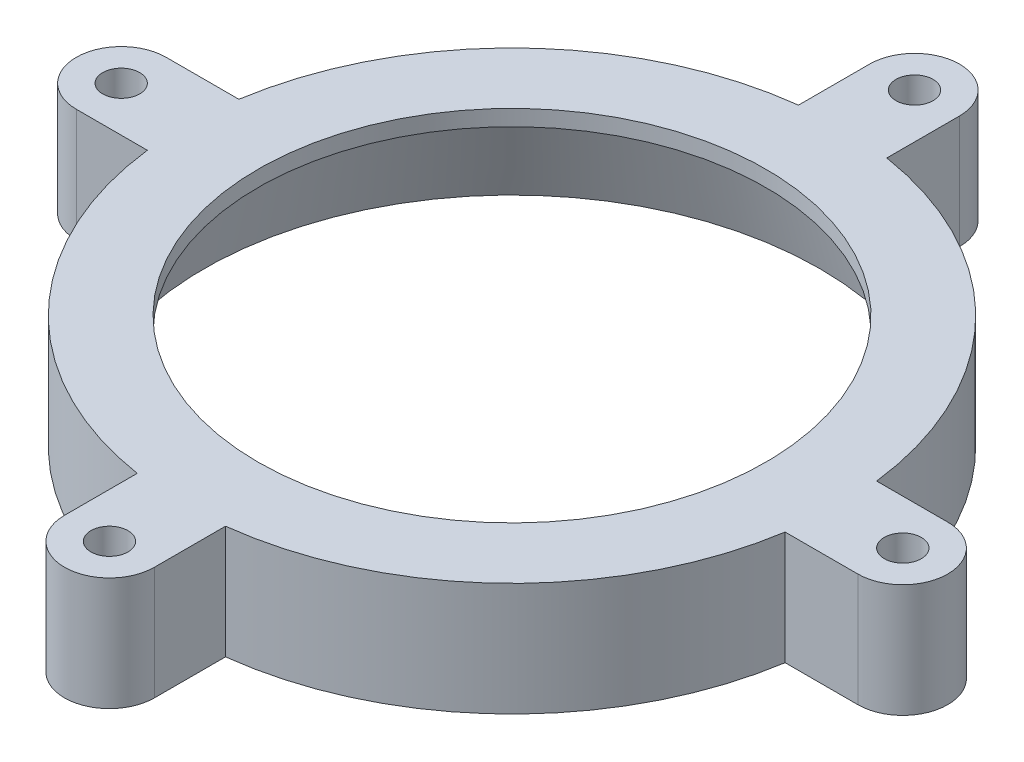
ISO-10303-21;
HEADER;
FILE_DESCRIPTION(('STEP AP214'),'2;1');
FILE_NAME('part.step','',(''),(''),'','','');
FILE_SCHEMA(('AUTOMOTIVE_DESIGN { 1 0 10303 214 1 1 1 1 }'));
ENDSEC;
DATA;
#1=APPLICATION_CONTEXT('core data for automotive mechanical design processes');
#2=APPLICATION_PROTOCOL_DEFINITION('international standard','automotive_design',2000,#1);
#3=PRODUCT_CONTEXT('',#1,'mechanical');
#4=PRODUCT('Part','Part','',(#3));
#5=PRODUCT_RELATED_PRODUCT_CATEGORY('part','',(#4));
#6=PRODUCT_DEFINITION_FORMATION('','',#4);
#7=PRODUCT_DEFINITION_CONTEXT('part definition',#1,'design');
#8=PRODUCT_DEFINITION('design','',#6,#7);
#9=PRODUCT_DEFINITION_SHAPE('','',#8);
#10=(LENGTH_UNIT() NAMED_UNIT(*) SI_UNIT(.MILLI.,.METRE.));
#11=(NAMED_UNIT(*) PLANE_ANGLE_UNIT() SI_UNIT($,.RADIAN.));
#12=(NAMED_UNIT(*) SI_UNIT($,.STERADIAN.) SOLID_ANGLE_UNIT());
#13=UNCERTAINTY_MEASURE_WITH_UNIT(LENGTH_MEASURE(1.E-05),#10,'distance_accuracy_value','');
#14=(GEOMETRIC_REPRESENTATION_CONTEXT(3) GLOBAL_UNCERTAINTY_ASSIGNED_CONTEXT((#13)) GLOBAL_UNIT_ASSIGNED_CONTEXT((#10,
#11,#12)) REPRESENTATION_CONTEXT('',''));
#15=CARTESIAN_POINT('',(0.,0.,0.));
#16=DIRECTION('',(0.,0.,1.));
#17=DIRECTION('',(1.,0.,0.));
#18=AXIS2_PLACEMENT_3D('',#15,#16,#17);
#19=CARTESIAN_POINT('',(-75.,-30.2482160476003,-1.11033693465306));
#20=DIRECTION('',(0.,1.,0.));
#21=DIRECTION('',(0.,0.,1.));
#22=AXIS2_PLACEMENT_3D('',#19,#20,#21);
#23=CYLINDRICAL_SURFACE('',#22,2.125);
#24=CARTESIAN_POINT('',(-75.,0.,-1.11033693465306));
#25=DIRECTION('',(0.,1.,0.));
#26=DIRECTION('',(0.,0.,1.));
#27=AXIS2_PLACEMENT_3D('',#24,#25,#26);
#28=CIRCLE('',#27,2.125);
#29=CARTESIAN_POINT('',(-75.,0.,1.01466306534694));
#30=VERTEX_POINT('',#29);
#31=EDGE_CURVE('E247',#30,#30,#28,.F.);
#32=ORIENTED_EDGE('',*,*,#31,.T.);
#33=EDGE_LOOP('',(#32));
#34=FACE_BOUND('',#33,.T.);
#35=CARTESIAN_POINT('',(-75.,12.,-1.11033693465306));
#36=DIRECTION('',(0.,1.,0.));
#37=DIRECTION('',(0.,0.,1.));
#38=AXIS2_PLACEMENT_3D('',#35,#36,#37);
#39=CIRCLE('',#38,2.125);
#40=CARTESIAN_POINT('',(-75.,12.,1.01466306534694));
#41=VERTEX_POINT('',#40);
#42=EDGE_CURVE('E43',#41,#41,#39,.F.);
#43=ORIENTED_EDGE('',*,*,#42,.F.);
#44=EDGE_LOOP('',(#43));
#45=FACE_BOUND('',#44,.T.);
#46=ADVANCED_FACE('F39',(#34,#45),#23,.F.);
#47=CARTESIAN_POINT('',(1.11033693465227,-30.2482160476005,-75.));
#48=DIRECTION('',(0.,1.,0.));
#49=DIRECTION('',(0.,0.,1.));
#50=AXIS2_PLACEMENT_3D('',#47,#48,#49);
#51=CYLINDRICAL_SURFACE('',#50,2.125);
#52=CARTESIAN_POINT('',(1.11033693465227,0.,-75.));
#53=DIRECTION('',(0.,1.,0.));
#54=DIRECTION('',(0.,0.,1.));
#55=AXIS2_PLACEMENT_3D('',#52,#53,#54);
#56=CIRCLE('',#55,2.125);
#57=CARTESIAN_POINT('',(1.11033693465227,0.,-72.875));
#58=VERTEX_POINT('',#57);
#59=EDGE_CURVE('E203',#58,#58,#56,.F.);
#60=ORIENTED_EDGE('',*,*,#59,.T.);
#61=EDGE_LOOP('',(#60));
#62=FACE_BOUND('',#61,.T.);
#63=CARTESIAN_POINT('',(1.11033693465227,12.,-75.));
#64=DIRECTION('',(0.,1.,0.));
#65=DIRECTION('',(0.,0.,1.));
#66=AXIS2_PLACEMENT_3D('',#63,#64,#65);
#67=CIRCLE('',#66,2.125);
#68=CARTESIAN_POINT('',(1.11033693465227,12.,-72.875));
#69=VERTEX_POINT('',#68);
#70=EDGE_CURVE('E294',#69,#69,#67,.F.);
#71=ORIENTED_EDGE('',*,*,#70,.F.);
#72=EDGE_LOOP('',(#71));
#73=FACE_BOUND('',#72,.T.);
#74=ADVANCED_FACE('F304',(#62,#73),#51,.F.);
#75=CARTESIAN_POINT('',(75.,-30.2482160476003,1.11033693465306));
#76=DIRECTION('',(0.,1.,0.));
#77=DIRECTION('',(0.,0.,1.));
#78=AXIS2_PLACEMENT_3D('',#75,#76,#77);
#79=CYLINDRICAL_SURFACE('',#78,2.125);
#80=CARTESIAN_POINT('',(75.,0.,1.11033693465306));
#81=DIRECTION('',(0.,1.,0.));
#82=DIRECTION('',(0.,0.,1.));
#83=AXIS2_PLACEMENT_3D('',#80,#81,#82);
#84=CIRCLE('',#83,2.125);
#85=CARTESIAN_POINT('',(75.,0.,3.23533693465306));
#86=VERTEX_POINT('',#85);
#87=EDGE_CURVE('E179',#86,#86,#84,.F.);
#88=ORIENTED_EDGE('',*,*,#87,.T.);
#89=EDGE_LOOP('',(#88));
#90=FACE_BOUND('',#89,.T.);
#91=CARTESIAN_POINT('',(75.,12.,1.11033693465306));
#92=DIRECTION('',(0.,1.,0.));
#93=DIRECTION('',(0.,0.,1.));
#94=AXIS2_PLACEMENT_3D('',#91,#92,#93);
#95=CIRCLE('',#94,2.125);
#96=CARTESIAN_POINT('',(75.,12.,3.23533693465306));
#97=VERTEX_POINT('',#96);
#98=EDGE_CURVE('E291',#97,#97,#95,.F.);
#99=ORIENTED_EDGE('',*,*,#98,.F.);
#100=EDGE_LOOP('',(#99));
#101=FACE_BOUND('',#100,.T.);
#102=ADVANCED_FACE('F311',(#90,#101),#79,.F.);
#103=CARTESIAN_POINT('',(-1.1103369346528,-30.2482160476003,75.));
#104=DIRECTION('',(0.,1.,0.));
#105=DIRECTION('',(0.,0.,1.));
#106=AXIS2_PLACEMENT_3D('',#103,#104,#105);
#107=CYLINDRICAL_SURFACE('',#106,2.125);
#108=CARTESIAN_POINT('',(-1.1103369346528,0.,75.));
#109=DIRECTION('',(0.,1.,0.));
#110=DIRECTION('',(0.,0.,1.));
#111=AXIS2_PLACEMENT_3D('',#108,#109,#110);
#112=CIRCLE('',#111,2.125);
#113=CARTESIAN_POINT('',(-1.1103369346528,0.,77.125));
#114=VERTEX_POINT('',#113);
#115=EDGE_CURVE('E189',#114,#114,#112,.F.);
#116=ORIENTED_EDGE('',*,*,#115,.T.);
#117=EDGE_LOOP('',(#116));
#118=FACE_BOUND('',#117,.T.);
#119=CARTESIAN_POINT('',(-1.1103369346528,12.,75.));
#120=DIRECTION('',(0.,1.,0.));
#121=DIRECTION('',(0.,0.,1.));
#122=AXIS2_PLACEMENT_3D('',#119,#120,#121);
#123=CIRCLE('',#122,2.125);
#124=CARTESIAN_POINT('',(-1.1103369346528,12.,77.125));
#125=VERTEX_POINT('',#124);
#126=EDGE_CURVE('E288',#125,#125,#123,.F.);
#127=ORIENTED_EDGE('',*,*,#126,.F.);
#128=EDGE_LOOP('',(#127));
#129=FACE_BOUND('',#128,.T.);
#130=ADVANCED_FACE('F369',(#118,#129),#107,.F.);
#131=CARTESIAN_POINT('',(0.,18.4,0.));
#132=DIRECTION('',(0.,-1.,0.));
#133=DIRECTION('',(0.,0.,-1.));
#134=AXIS2_PLACEMENT_3D('',#131,#132,#133);
#135=CYLINDRICAL_SURFACE('',#134,62.);
#136=DIRECTION('',(0.,-1.,0.));
#137=VECTOR('',#136,1.);
#138=CARTESIAN_POINT('',(7.38966306534715,18.4,61.558044801477));
#139=LINE('',#138,#137);
#140=CARTESIAN_POINT('',(7.38966306534715,0.,61.558044801477));
#141=VERTEX_POINT('',#140);
#142=CARTESIAN_POINT('',(7.38966306534715,21.4,61.558044801477));
#143=VERTEX_POINT('',#142);
#144=EDGE_CURVE('E170',#141,#143,#139,.F.);
#145=ORIENTED_EDGE('',*,*,#144,.F.);
#146=CARTESIAN_POINT('',(0.,0.,0.));
#147=DIRECTION('',(0.,-1.,0.));
#148=DIRECTION('',(0.,0.,-1.));
#149=AXIS2_PLACEMENT_3D('',#146,#147,#148);
#150=CIRCLE('',#149,62.);
#151=CARTESIAN_POINT('',(61.2506442741825,0.,9.61033693465306));
#152=VERTEX_POINT('',#151);
#153=EDGE_CURVE('E358',#152,#141,#150,.T.);
#154=ORIENTED_EDGE('',*,*,#153,.F.);
#155=DIRECTION('',(0.,-1.,0.));
#156=VECTOR('',#155,1.);
#157=CARTESIAN_POINT('',(61.2506442741825,18.4,9.61033693465306));
#158=LINE('',#157,#156);
#159=CARTESIAN_POINT('',(61.2506442741825,21.4,9.61033693465306));
#160=VERTEX_POINT('',#159);
#161=EDGE_CURVE('E237',#160,#152,#158,.T.);
#162=ORIENTED_EDGE('',*,*,#161,.F.);
#163=CARTESIAN_POINT('',(0.,21.4,0.));
#164=DIRECTION('',(0.,1.,0.));
#165=DIRECTION('',(0.,0.,1.));
#166=AXIS2_PLACEMENT_3D('',#163,#164,#165);
#167=CIRCLE('',#166,62.);
#168=EDGE_CURVE('E281',#143,#160,#167,.T.);
#169=ORIENTED_EDGE('',*,*,#168,.F.);
#170=EDGE_LOOP('',(#145,#154,#162,#169));
#171=FACE_BOUND('',#170,.T.);
#172=ADVANCED_FACE('F345',(#171),#135,.T.);
#173=DIRECTION('',(0.,-1.,0.));
#174=VECTOR('',#173,1.);
#175=CARTESIAN_POINT('',(61.558044801477,18.4,-7.38966306534694));
#176=LINE('',#175,#174);
#177=CARTESIAN_POINT('',(61.558044801477,0.,-7.38966306534694));
#178=VERTEX_POINT('',#177);
#179=CARTESIAN_POINT('',(61.558044801477,21.4,-7.38966306534694));
#180=VERTEX_POINT('',#179);
#181=EDGE_CURVE('E239',#178,#180,#176,.F.);
#182=ORIENTED_EDGE('',*,*,#181,.F.);
#183=CARTESIAN_POINT('',(9.61033693465242,0.,-61.2506442741826));
#184=VERTEX_POINT('',#183);
#185=EDGE_CURVE('E283',#184,#178,#150,.T.);
#186=ORIENTED_EDGE('',*,*,#185,.F.);
#187=DIRECTION('',(0.,-1.,0.));
#188=VECTOR('',#187,1.);
#189=CARTESIAN_POINT('',(9.61033693465242,18.4,-61.2506442741826));
#190=LINE('',#189,#188);
#191=CARTESIAN_POINT('',(9.61033693465242,21.4,-61.2506442741826));
#192=VERTEX_POINT('',#191);
#193=EDGE_CURVE('E192',#192,#184,#190,.T.);
#194=ORIENTED_EDGE('',*,*,#193,.F.);
#195=EDGE_CURVE('E430',#180,#192,#167,.T.);
#196=ORIENTED_EDGE('',*,*,#195,.F.);
#197=EDGE_LOOP('',(#182,#186,#194,#196));
#198=FACE_BOUND('',#197,.T.);
#199=ADVANCED_FACE('F354',(#198),#135,.T.);
#200=DIRECTION('',(0.,-1.,0.));
#201=VECTOR('',#200,1.);
#202=CARTESIAN_POINT('',(-7.38966306534758,18.4,-61.5580448014769));
#203=LINE('',#202,#201);
#204=CARTESIAN_POINT('',(-7.38966306534758,0.,-61.5580448014769));
#205=VERTEX_POINT('',#204);
#206=CARTESIAN_POINT('',(-7.38966306534758,21.4,-61.5580448014769));
#207=VERTEX_POINT('',#206);
#208=EDGE_CURVE('E235',#205,#207,#203,.F.);
#209=ORIENTED_EDGE('',*,*,#208,.F.);
#210=CARTESIAN_POINT('',(-61.2506442741825,0.,-9.61033693465306));
#211=VERTEX_POINT('',#210);
#212=EDGE_CURVE('E48',#211,#205,#150,.T.);
#213=ORIENTED_EDGE('',*,*,#212,.F.);
#214=DIRECTION('',(0.,-1.,0.));
#215=VECTOR('',#214,1.);
#216=CARTESIAN_POINT('',(-61.2506442741825,18.4,-9.61033693465306));
#217=LINE('',#216,#215);
#218=CARTESIAN_POINT('',(-61.2506442741825,21.4,-9.61033693465306));
#219=VERTEX_POINT('',#218);
#220=EDGE_CURVE('E266',#219,#211,#217,.T.);
#221=ORIENTED_EDGE('',*,*,#220,.F.);
#222=EDGE_CURVE('E275',#207,#219,#167,.T.);
#223=ORIENTED_EDGE('',*,*,#222,.F.);
#224=EDGE_LOOP('',(#209,#213,#221,#223));
#225=FACE_BOUND('',#224,.T.);
#226=ADVANCED_FACE('F346',(#225),#135,.T.);
#227=CARTESIAN_POINT('',(0.,0.,0.));
#228=DIRECTION('',(0.,1.,0.));
#229=DIRECTION('',(0.,0.,1.));
#230=AXIS2_PLACEMENT_3D('',#227,#228,#229);
#231=PLANE('',#230);
#232=ORIENTED_EDGE('',*,*,#153,.T.);
#233=DIRECTION('',(0.,0.,1.));
#234=VECTOR('',#233,1.);
#235=CARTESIAN_POINT('',(7.38966306534714,0.,58.4809158028855));
#236=LINE('',#235,#234);
#237=CARTESIAN_POINT('',(7.3896630653472,0.,75.));
#238=VERTEX_POINT('',#237);
#239=EDGE_CURVE('E193',#141,#238,#236,.T.);
#240=ORIENTED_EDGE('',*,*,#239,.T.);
#241=CARTESIAN_POINT('',(-1.1103369346528,0.,75.));
#242=DIRECTION('',(0.,1.,0.));
#243=DIRECTION('',(0.,0.,1.));
#244=AXIS2_PLACEMENT_3D('',#241,#242,#243);
#245=CIRCLE('',#244,8.5);
#246=CARTESIAN_POINT('',(-9.6103369346528,0.,75.));
#247=VERTEX_POINT('',#246);
#248=EDGE_CURVE('E161',#238,#247,#245,.F.);
#249=ORIENTED_EDGE('',*,*,#248,.T.);
#250=DIRECTION('',(0.,0.,-1.));
#251=VECTOR('',#250,1.);
#252=CARTESIAN_POINT('',(-9.6103369346528,0.,75.));
#253=LINE('',#252,#251);
#254=CARTESIAN_POINT('',(-9.61033693465285,0.,61.2506442741825));
#255=VERTEX_POINT('',#254);
#256=EDGE_CURVE('E56',#247,#255,#253,.T.);
#257=ORIENTED_EDGE('',*,*,#256,.T.);
#258=CARTESIAN_POINT('',(-61.558044801477,0.,7.38966306534694));
#259=VERTEX_POINT('',#258);
#260=EDGE_CURVE('E284',#255,#259,#150,.T.);
#261=ORIENTED_EDGE('',*,*,#260,.T.);
#262=DIRECTION('',(-1.,0.,0.));
#263=VECTOR('',#262,1.);
#264=CARTESIAN_POINT('',(-58.4809158028855,0.,7.38966306534694));
#265=LINE('',#264,#263);
#266=CARTESIAN_POINT('',(-75.,0.,7.38966306534694));
#267=VERTEX_POINT('',#266);
#268=EDGE_CURVE('E245',#259,#267,#265,.T.);
#269=ORIENTED_EDGE('',*,*,#268,.T.);
#270=CARTESIAN_POINT('',(-75.,0.,-1.11033693465306));
#271=DIRECTION('',(0.,1.,0.));
#272=DIRECTION('',(0.,0.,1.));
#273=AXIS2_PLACEMENT_3D('',#270,#271,#272);
#274=CIRCLE('',#273,8.5);
#275=CARTESIAN_POINT('',(-75.,0.,-9.61033693465306));
#276=VERTEX_POINT('',#275);
#277=EDGE_CURVE('E248',#267,#276,#274,.F.);
#278=ORIENTED_EDGE('',*,*,#277,.T.);
#279=DIRECTION('',(1.,0.,0.));
#280=VECTOR('',#279,1.);
#281=CARTESIAN_POINT('',(-75.,0.,-9.61033693465306));
#282=LINE('',#281,#280);
#283=EDGE_CURVE('E249',#276,#211,#282,.T.);
#284=ORIENTED_EDGE('',*,*,#283,.T.);
#285=ORIENTED_EDGE('',*,*,#212,.T.);
#286=DIRECTION('',(0.,0.,-1.));
#287=VECTOR('',#286,1.);
#288=CARTESIAN_POINT('',(-7.38966306534755,0.,-58.4809158028855));
#289=LINE('',#288,#287);
#290=CARTESIAN_POINT('',(-7.38966306534773,0.,-74.9999999999999));
#291=VERTEX_POINT('',#290);
#292=EDGE_CURVE('E212',#205,#291,#289,.T.);
#293=ORIENTED_EDGE('',*,*,#292,.T.);
#294=CARTESIAN_POINT('',(1.11033693465227,0.,-75.));
#295=DIRECTION('',(0.,1.,0.));
#296=DIRECTION('',(0.,0.,1.));
#297=AXIS2_PLACEMENT_3D('',#294,#295,#296);
#298=CIRCLE('',#297,8.5);
#299=CARTESIAN_POINT('',(9.61033693465227,0.,-75.0000000000001));
#300=VERTEX_POINT('',#299);
#301=EDGE_CURVE('E214',#291,#300,#298,.F.);
#302=ORIENTED_EDGE('',*,*,#301,.T.);
#303=DIRECTION('',(0.,0.,1.));
#304=VECTOR('',#303,1.);
#305=CARTESIAN_POINT('',(9.61033693465227,0.,-75.0000000000001));
#306=LINE('',#305,#304);
#307=EDGE_CURVE('E215',#300,#184,#306,.T.);
#308=ORIENTED_EDGE('',*,*,#307,.T.);
#309=ORIENTED_EDGE('',*,*,#185,.T.);
#310=DIRECTION('',(1.,0.,0.));
#311=VECTOR('',#310,1.);
#312=CARTESIAN_POINT('',(58.4809158028855,0.,-7.38966306534694));
#313=LINE('',#312,#311);
#314=CARTESIAN_POINT('',(75.,0.,-7.38966306534694));
#315=VERTEX_POINT('',#314);
#316=EDGE_CURVE('E182',#178,#315,#313,.T.);
#317=ORIENTED_EDGE('',*,*,#316,.T.);
#318=CARTESIAN_POINT('',(75.,0.,1.11033693465306));
#319=DIRECTION('',(0.,1.,0.));
#320=DIRECTION('',(0.,0.,1.));
#321=AXIS2_PLACEMENT_3D('',#318,#319,#320);
#322=CIRCLE('',#321,8.5);
#323=CARTESIAN_POINT('',(75.,0.,9.61033693465306));
#324=VERTEX_POINT('',#323);
#325=EDGE_CURVE('E195',#315,#324,#322,.F.);
#326=ORIENTED_EDGE('',*,*,#325,.T.);
#327=DIRECTION('',(-1.,0.,0.));
#328=VECTOR('',#327,1.);
#329=CARTESIAN_POINT('',(75.,0.,9.61033693465306));
#330=LINE('',#329,#328);
#331=EDGE_CURVE('E63',#324,#152,#330,.T.);
#332=ORIENTED_EDGE('',*,*,#331,.T.);
#333=EDGE_LOOP('',(#232,#240,#249,#257,#261,#269,#278,#284,#285,#293,#302,#308,#309,#317,#326,#332));
#334=FACE_BOUND('',#333,.T.);
#335=CARTESIAN_POINT('',(0.,0.,0.));
#336=DIRECTION('',(0.,1.,0.));
#337=DIRECTION('',(0.,0.,1.));
#338=AXIS2_PLACEMENT_3D('',#335,#336,#337);
#339=CIRCLE('',#338,58.2);
#340=CARTESIAN_POINT('',(0.,0.,58.2));
#341=VERTEX_POINT('',#340);
#342=EDGE_CURVE('E11',#341,#341,#339,.T.);
#343=ORIENTED_EDGE('',*,*,#342,.T.);
#344=EDGE_LOOP('',(#343));
#345=FACE_BOUND('',#344,.T.);
#346=ORIENTED_EDGE('',*,*,#31,.F.);
#347=EDGE_LOOP('',(#346));
#348=FACE_BOUND('',#347,.T.);
#349=ORIENTED_EDGE('',*,*,#59,.F.);
#350=EDGE_LOOP('',(#349));
#351=FACE_BOUND('',#350,.T.);
#352=ORIENTED_EDGE('',*,*,#87,.F.);
#353=EDGE_LOOP('',(#352));
#354=FACE_BOUND('',#353,.T.);
#355=ORIENTED_EDGE('',*,*,#115,.F.);
#356=EDGE_LOOP('',(#355));
#357=FACE_BOUND('',#356,.T.);
#358=ADVANCED_FACE('F347',(#334,#345,#348,#351,#354,#357),#231,.F.);
#359=CARTESIAN_POINT('',(0.,0.,0.));
#360=DIRECTION('',(0.,-1.,0.));
#361=DIRECTION('',(0.,0.,1.));
#362=AXIS2_PLACEMENT_3D('',#359,#360,#361);
#363=CONICAL_SURFACE('',#362,58.2,0.26179938779915);
#364=CARTESIAN_POINT('',(0.,18.4,0.));
#365=DIRECTION('',(0.,1.,0.));
#366=DIRECTION('',(0.,0.,1.));
#367=AXIS2_PLACEMENT_3D('',#364,#365,#366);
#368=CIRCLE('',#367,53.2697348592673);
#369=CARTESIAN_POINT('',(0.,18.4,53.2697348592673));
#370=VERTEX_POINT('',#369);
#371=EDGE_CURVE('E280',#370,#370,#368,.T.);
#372=ORIENTED_EDGE('',*,*,#371,.T.);
#373=EDGE_LOOP('',(#372));
#374=FACE_BOUND('',#373,.T.);
#375=ORIENTED_EDGE('',*,*,#342,.F.);
#376=EDGE_LOOP('',(#375));
#377=FACE_BOUND('',#376,.T.);
#378=ADVANCED_FACE('F41',(#374,#377),#363,.F.);
#379=DIRECTION('',(0.,-1.,0.));
#380=VECTOR('',#379,1.);
#381=CARTESIAN_POINT('',(-9.61033693465285,18.4,61.2506442741825));
#382=LINE('',#381,#380);
#383=CARTESIAN_POINT('',(-9.61033693465285,21.4,61.2506442741825));
#384=VERTEX_POINT('',#383);
#385=EDGE_CURVE('E241',#384,#255,#382,.T.);
#386=ORIENTED_EDGE('',*,*,#385,.F.);
#387=CARTESIAN_POINT('',(-61.558044801477,21.4,7.38966306534694));
#388=VERTEX_POINT('',#387);
#389=EDGE_CURVE('E278',#388,#384,#167,.T.);
#390=ORIENTED_EDGE('',*,*,#389,.F.);
#391=DIRECTION('',(0.,-1.,0.));
#392=VECTOR('',#391,1.);
#393=CARTESIAN_POINT('',(-61.558044801477,18.4,7.38966306534694));
#394=LINE('',#393,#392);
#395=EDGE_CURVE('E269',#259,#388,#394,.F.);
#396=ORIENTED_EDGE('',*,*,#395,.F.);
#397=ORIENTED_EDGE('',*,*,#260,.F.);
#398=EDGE_LOOP('',(#386,#390,#396,#397));
#399=FACE_BOUND('',#398,.T.);
#400=ADVANCED_FACE('F341',(#399),#135,.T.);
#401=CARTESIAN_POINT('',(0.,18.4,0.));
#402=DIRECTION('',(0.,1.,0.));
#403=DIRECTION('',(0.,0.,1.));
#404=AXIS2_PLACEMENT_3D('',#401,#402,#403);
#405=PLANE('',#404);
#406=CARTESIAN_POINT('',(0.,18.4,0.));
#407=DIRECTION('',(0.,1.,0.));
#408=DIRECTION('',(0.,0.,1.));
#409=AXIS2_PLACEMENT_3D('',#406,#407,#408);
#410=CIRCLE('',#409,48.);
#411=CARTESIAN_POINT('',(0.,18.4,48.));
#412=VERTEX_POINT('',#411);
#413=EDGE_CURVE('E271',#412,#412,#410,.T.);
#414=ORIENTED_EDGE('',*,*,#413,.T.);
#415=EDGE_LOOP('',(#414));
#416=FACE_BOUND('',#415,.T.);
#417=ORIENTED_EDGE('',*,*,#371,.F.);
#418=EDGE_LOOP('',(#417));
#419=FACE_BOUND('',#418,.T.);
#420=ADVANCED_FACE('F337',(#416,#419),#405,.F.);
#421=CARTESIAN_POINT('',(0.,21.4,0.));
#422=DIRECTION('',(0.,1.,0.));
#423=DIRECTION('',(0.,0.,1.));
#424=AXIS2_PLACEMENT_3D('',#421,#422,#423);
#425=PLANE('',#424);
#426=CARTESIAN_POINT('',(-75.,21.4,-1.11033693465306));
#427=DIRECTION('',(0.,1.,0.));
#428=DIRECTION('',(0.,0.,1.));
#429=AXIS2_PLACEMENT_3D('',#426,#427,#428);
#430=CIRCLE('',#429,3.50000000000001);
#431=CARTESIAN_POINT('',(-75.,21.4,2.38966306534695));
#432=VERTEX_POINT('',#431);
#433=EDGE_CURVE('E475',#432,#432,#430,.T.);
#434=ORIENTED_EDGE('',*,*,#433,.F.);
#435=EDGE_LOOP('',(#434));
#436=FACE_BOUND('',#435,.T.);
#437=CARTESIAN_POINT('',(1.11033693465332,21.4,-75.));
#438=DIRECTION('',(0.,1.,0.));
#439=DIRECTION('',(0.,0.,1.));
#440=AXIS2_PLACEMENT_3D('',#437,#438,#439);
#441=CIRCLE('',#440,3.50000000000002);
#442=CARTESIAN_POINT('',(1.11033693465332,21.4,-71.5));
#443=VERTEX_POINT('',#442);
#444=EDGE_CURVE('E472',#443,#443,#441,.T.);
#445=ORIENTED_EDGE('',*,*,#444,.F.);
#446=EDGE_LOOP('',(#445));
#447=FACE_BOUND('',#446,.T.);
#448=CARTESIAN_POINT('',(75.,21.4,1.11033693465358));
#449=DIRECTION('',(0.,1.,0.));
#450=DIRECTION('',(0.,0.,1.));
#451=AXIS2_PLACEMENT_3D('',#448,#449,#450);
#452=CIRCLE('',#451,3.5);
#453=CARTESIAN_POINT('',(75.,21.4,4.61033693465358));
#454=VERTEX_POINT('',#453);
#455=EDGE_CURVE('E466',#454,#454,#452,.T.);
#456=ORIENTED_EDGE('',*,*,#455,.F.);
#457=EDGE_LOOP('',(#456));
#458=FACE_BOUND('',#457,.T.);
#459=CARTESIAN_POINT('',(-1.11033693465384,21.4,75.));
#460=DIRECTION('',(0.,1.,0.));
#461=DIRECTION('',(0.,0.,1.));
#462=AXIS2_PLACEMENT_3D('',#459,#460,#461);
#463=CIRCLE('',#462,3.50000000000001);
#464=CARTESIAN_POINT('',(-1.11033693465384,21.4,78.5));
#465=VERTEX_POINT('',#464);
#466=EDGE_CURVE('E460',#465,#465,#463,.T.);
#467=ORIENTED_EDGE('',*,*,#466,.F.);
#468=EDGE_LOOP('',(#467));
#469=FACE_BOUND('',#468,.T.);
#470=ORIENTED_EDGE('',*,*,#389,.T.);
#471=DIRECTION('',(0.,0.,1.));
#472=VECTOR('',#471,1.);
#473=CARTESIAN_POINT('',(-9.6103369346528,21.4,75.));
#474=LINE('',#473,#472);
#475=CARTESIAN_POINT('',(-9.6103369346528,21.4,75.));
#476=VERTEX_POINT('',#475);
#477=EDGE_CURVE('E164',#384,#476,#474,.T.);
#478=ORIENTED_EDGE('',*,*,#477,.T.);
#479=CARTESIAN_POINT('',(-1.1103369346528,21.4,75.));
#480=DIRECTION('',(0.,1.,0.));
#481=DIRECTION('',(1.,0.,0.));
#482=AXIS2_PLACEMENT_3D('',#479,#480,#481);
#483=CIRCLE('',#482,8.5);
#484=CARTESIAN_POINT('',(7.3896630653472,21.4,75.));
#485=VERTEX_POINT('',#484);
#486=EDGE_CURVE('E160',#476,#485,#483,.T.);
#487=ORIENTED_EDGE('',*,*,#486,.T.);
#488=DIRECTION('',(0.,0.,-1.));
#489=VECTOR('',#488,1.);
#490=CARTESIAN_POINT('',(7.38966306534714,21.4,58.4809158028855));
#491=LINE('',#490,#489);
#492=EDGE_CURVE('E167',#485,#143,#491,.T.);
#493=ORIENTED_EDGE('',*,*,#492,.T.);
#494=ORIENTED_EDGE('',*,*,#168,.T.);
#495=DIRECTION('',(1.,0.,0.));
#496=VECTOR('',#495,1.);
#497=CARTESIAN_POINT('',(75.,21.4,9.61033693465306));
#498=LINE('',#497,#496);
#499=CARTESIAN_POINT('',(75.,21.4,9.61033693465306));
#500=VERTEX_POINT('',#499);
#501=EDGE_CURVE('E206',#160,#500,#498,.T.);
#502=ORIENTED_EDGE('',*,*,#501,.T.);
#503=CARTESIAN_POINT('',(75.,21.4,1.11033693465306));
#504=DIRECTION('',(0.,1.,0.));
#505=DIRECTION('',(0.,0.,-1.));
#506=AXIS2_PLACEMENT_3D('',#503,#504,#505);
#507=CIRCLE('',#506,8.5);
#508=CARTESIAN_POINT('',(75.,21.4,-7.38966306534694));
#509=VERTEX_POINT('',#508);
#510=EDGE_CURVE('E199',#500,#509,#507,.T.);
#511=ORIENTED_EDGE('',*,*,#510,.T.);
#512=DIRECTION('',(-1.,0.,0.));
#513=VECTOR('',#512,1.);
#514=CARTESIAN_POINT('',(58.4809158028855,21.4,-7.38966306534694));
#515=LINE('',#514,#513);
#516=EDGE_CURVE('E202',#509,#180,#515,.T.);
#517=ORIENTED_EDGE('',*,*,#516,.T.);
#518=ORIENTED_EDGE('',*,*,#195,.T.);
#519=DIRECTION('',(0.,0.,-1.));
#520=VECTOR('',#519,1.);
#521=CARTESIAN_POINT('',(9.61033693465227,21.4,-75.0000000000001));
#522=LINE('',#521,#520);
#523=CARTESIAN_POINT('',(9.61033693465227,21.4,-75.0000000000001));
#524=VERTEX_POINT('',#523);
#525=EDGE_CURVE('E225',#192,#524,#522,.T.);
#526=ORIENTED_EDGE('',*,*,#525,.T.);
#527=CARTESIAN_POINT('',(1.11033693465227,21.4,-75.));
#528=DIRECTION('',(0.,1.,0.));
#529=DIRECTION('',(-1.,0.,0.));
#530=AXIS2_PLACEMENT_3D('',#527,#528,#529);
#531=CIRCLE('',#530,8.5);
#532=CARTESIAN_POINT('',(-7.38966306534773,21.4,-74.9999999999999));
#533=VERTEX_POINT('',#532);
#534=EDGE_CURVE('E219',#524,#533,#531,.T.);
#535=ORIENTED_EDGE('',*,*,#534,.T.);
#536=DIRECTION('',(0.,0.,1.));
#537=VECTOR('',#536,1.);
#538=CARTESIAN_POINT('',(-7.38966306534755,21.4,-58.4809158028855));
#539=LINE('',#538,#537);
#540=EDGE_CURVE('E222',#533,#207,#539,.T.);
#541=ORIENTED_EDGE('',*,*,#540,.T.);
#542=ORIENTED_EDGE('',*,*,#222,.T.);
#543=DIRECTION('',(-1.,0.,0.));
#544=VECTOR('',#543,1.);
#545=CARTESIAN_POINT('',(-75.,21.4,-9.61033693465306));
#546=LINE('',#545,#544);
#547=CARTESIAN_POINT('',(-75.,21.4,-9.61033693465306));
#548=VERTEX_POINT('',#547);
#549=EDGE_CURVE('E258',#219,#548,#546,.T.);
#550=ORIENTED_EDGE('',*,*,#549,.T.);
#551=CARTESIAN_POINT('',(-75.,21.4,-1.11033693465306));
#552=DIRECTION('',(0.,1.,0.));
#553=DIRECTION('',(0.,0.,1.));
#554=AXIS2_PLACEMENT_3D('',#551,#552,#553);
#555=CIRCLE('',#554,8.5);
#556=CARTESIAN_POINT('',(-75.,21.4,7.38966306534694));
#557=VERTEX_POINT('',#556);
#558=EDGE_CURVE('E244',#548,#557,#555,.T.);
#559=ORIENTED_EDGE('',*,*,#558,.T.);
#560=DIRECTION('',(1.,0.,0.));
#561=VECTOR('',#560,1.);
#562=CARTESIAN_POINT('',(-58.4809158028855,21.4,7.38966306534694));
#563=LINE('',#562,#561);
#564=EDGE_CURVE('E255',#557,#388,#563,.T.);
#565=ORIENTED_EDGE('',*,*,#564,.T.);
#566=EDGE_LOOP('',(#470,#478,#487,#493,#494,#502,#511,#517,#518,#526,#535,#541,#542,#550,#559,#565));
#567=FACE_BOUND('',#566,.T.);
#568=CARTESIAN_POINT('',(0.,21.4,0.));
#569=DIRECTION('',(0.,1.,0.));
#570=DIRECTION('',(0.,0.,1.));
#571=AXIS2_PLACEMENT_3D('',#568,#569,#570);
#572=CIRCLE('',#571,48.);
#573=CARTESIAN_POINT('',(0.,21.4,48.));
#574=VERTEX_POINT('',#573);
#575=EDGE_CURVE('E272',#574,#574,#572,.T.);
#576=ORIENTED_EDGE('',*,*,#575,.F.);
#577=EDGE_LOOP('',(#576));
#578=FACE_BOUND('',#577,.T.);
#579=ADVANCED_FACE('F176',(#436,#447,#458,#469,#567,#578),#425,.T.);
#580=CARTESIAN_POINT('',(0.,21.4,0.));
#581=DIRECTION('',(0.,-1.,0.));
#582=DIRECTION('',(0.,0.,-1.));
#583=AXIS2_PLACEMENT_3D('',#580,#581,#582);
#584=CYLINDRICAL_SURFACE('',#583,48.);
#585=ORIENTED_EDGE('',*,*,#575,.T.);
#586=EDGE_LOOP('',(#585));
#587=FACE_BOUND('',#586,.T.);
#588=ORIENTED_EDGE('',*,*,#413,.F.);
#589=EDGE_LOOP('',(#588));
#590=FACE_BOUND('',#589,.T.);
#591=ADVANCED_FACE('F326',(#587,#590),#584,.F.);
#592=CARTESIAN_POINT('',(-58.4809158028855,-30.2482160476003,7.38966306534694));
#593=DIRECTION('',(0.,0.,1.));
#594=DIRECTION('',(1.,0.,0.));
#595=AXIS2_PLACEMENT_3D('',#592,#593,#594);
#596=PLANE('',#595);
#597=ORIENTED_EDGE('',*,*,#268,.F.);
#598=ORIENTED_EDGE('',*,*,#395,.T.);
#599=ORIENTED_EDGE('',*,*,#564,.F.);
#600=DIRECTION('',(0.,1.,0.));
#601=VECTOR('',#600,1.);
#602=CARTESIAN_POINT('',(-75.,-30.2482160476003,7.38966306534694));
#603=LINE('',#602,#601);
#604=EDGE_CURVE('E260',#267,#557,#603,.T.);
#605=ORIENTED_EDGE('',*,*,#604,.F.);
#606=EDGE_LOOP('',(#597,#598,#599,#605));
#607=FACE_BOUND('',#606,.T.);
#608=ADVANCED_FACE('F322',(#607),#596,.T.);
#609=CARTESIAN_POINT('',(-75.,-30.2482160476003,-9.61033693465306));
#610=DIRECTION('',(0.,0.,-1.));
#611=DIRECTION('',(-1.,0.,0.));
#612=AXIS2_PLACEMENT_3D('',#609,#610,#611);
#613=PLANE('',#612);
#614=ORIENTED_EDGE('',*,*,#549,.F.);
#615=ORIENTED_EDGE('',*,*,#220,.T.);
#616=ORIENTED_EDGE('',*,*,#283,.F.);
#617=DIRECTION('',(0.,1.,0.));
#618=VECTOR('',#617,1.);
#619=CARTESIAN_POINT('',(-75.,-30.2482160476003,-9.61033693465306));
#620=LINE('',#619,#618);
#621=EDGE_CURVE('E251',#276,#548,#620,.T.);
#622=ORIENTED_EDGE('',*,*,#621,.T.);
#623=EDGE_LOOP('',(#614,#615,#616,#622));
#624=FACE_BOUND('',#623,.T.);
#625=ADVANCED_FACE('F318',(#624),#613,.T.);
#626=CARTESIAN_POINT('',(-75.,-30.2482160476003,-1.11033693465306));
#627=DIRECTION('',(0.,1.,0.));
#628=DIRECTION('',(0.,0.,1.));
#629=AXIS2_PLACEMENT_3D('',#626,#627,#628);
#630=CYLINDRICAL_SURFACE('',#629,8.5);
#631=ORIENTED_EDGE('',*,*,#277,.F.);
#632=ORIENTED_EDGE('',*,*,#604,.T.);
#633=ORIENTED_EDGE('',*,*,#558,.F.);
#634=ORIENTED_EDGE('',*,*,#621,.F.);
#635=EDGE_LOOP('',(#631,#632,#633,#634));
#636=FACE_BOUND('',#635,.T.);
#637=ADVANCED_FACE('F321',(#636),#630,.T.);
#638=CARTESIAN_POINT('',(-7.38966306534755,-30.2482160476005,-58.4809158028855));
#639=DIRECTION('',(-1.,0.,0.));
#640=DIRECTION('',(0.,0.,1.));
#641=AXIS2_PLACEMENT_3D('',#638,#639,#640);
#642=PLANE('',#641);
#643=ORIENTED_EDGE('',*,*,#292,.F.);
#644=ORIENTED_EDGE('',*,*,#208,.T.);
#645=ORIENTED_EDGE('',*,*,#540,.F.);
#646=DIRECTION('',(0.,1.,0.));
#647=VECTOR('',#646,1.);
#648=CARTESIAN_POINT('',(-7.38966306534773,-30.2482160476005,-74.9999999999999));
#649=LINE('',#648,#647);
#650=EDGE_CURVE('E227',#291,#533,#649,.T.);
#651=ORIENTED_EDGE('',*,*,#650,.F.);
#652=EDGE_LOOP('',(#643,#644,#645,#651));
#653=FACE_BOUND('',#652,.T.);
#654=ADVANCED_FACE('F330',(#653),#642,.T.);
#655=CARTESIAN_POINT('',(9.61033693465227,-30.2482160476005,-75.0000000000001));
#656=DIRECTION('',(1.,0.,0.));
#657=DIRECTION('',(0.,0.,-1.));
#658=AXIS2_PLACEMENT_3D('',#655,#656,#657);
#659=PLANE('',#658);
#660=ORIENTED_EDGE('',*,*,#525,.F.);
#661=ORIENTED_EDGE('',*,*,#193,.T.);
#662=ORIENTED_EDGE('',*,*,#307,.F.);
#663=DIRECTION('',(0.,1.,0.));
#664=VECTOR('',#663,1.);
#665=CARTESIAN_POINT('',(9.61033693465227,-30.2482160476005,-75.0000000000001));
#666=LINE('',#665,#664);
#667=EDGE_CURVE('E217',#300,#524,#666,.T.);
#668=ORIENTED_EDGE('',*,*,#667,.T.);
#669=EDGE_LOOP('',(#660,#661,#662,#668));
#670=FACE_BOUND('',#669,.T.);
#671=ADVANCED_FACE('F411',(#670),#659,.T.);
#672=CARTESIAN_POINT('',(1.11033693465227,-30.2482160476005,-75.));
#673=DIRECTION('',(0.,1.,0.));
#674=DIRECTION('',(0.,0.,1.));
#675=AXIS2_PLACEMENT_3D('',#672,#673,#674);
#676=CYLINDRICAL_SURFACE('',#675,8.5);
#677=ORIENTED_EDGE('',*,*,#301,.F.);
#678=ORIENTED_EDGE('',*,*,#650,.T.);
#679=ORIENTED_EDGE('',*,*,#534,.F.);
#680=ORIENTED_EDGE('',*,*,#667,.F.);
#681=EDGE_LOOP('',(#677,#678,#679,#680));
#682=FACE_BOUND('',#681,.T.);
#683=ADVANCED_FACE('F316',(#682),#676,.T.);
#684=CARTESIAN_POINT('',(58.4809158028855,-30.2482160476003,-7.38966306534694));
#685=DIRECTION('',(0.,0.,-1.));
#686=DIRECTION('',(-1.,0.,0.));
#687=AXIS2_PLACEMENT_3D('',#684,#685,#686);
#688=PLANE('',#687);
#689=ORIENTED_EDGE('',*,*,#316,.F.);
#690=ORIENTED_EDGE('',*,*,#181,.T.);
#691=ORIENTED_EDGE('',*,*,#516,.F.);
#692=DIRECTION('',(0.,1.,0.));
#693=VECTOR('',#692,1.);
#694=CARTESIAN_POINT('',(75.,-30.2482160476003,-7.38966306534694));
#695=LINE('',#694,#693);
#696=EDGE_CURVE('E208',#315,#509,#695,.T.);
#697=ORIENTED_EDGE('',*,*,#696,.F.);
#698=EDGE_LOOP('',(#689,#690,#691,#697));
#699=FACE_BOUND('',#698,.T.);
#700=ADVANCED_FACE('F403',(#699),#688,.T.);
#701=CARTESIAN_POINT('',(75.,-30.2482160476003,9.61033693465306));
#702=DIRECTION('',(0.,0.,1.));
#703=DIRECTION('',(1.,0.,0.));
#704=AXIS2_PLACEMENT_3D('',#701,#702,#703);
#705=PLANE('',#704);
#706=ORIENTED_EDGE('',*,*,#501,.F.);
#707=ORIENTED_EDGE('',*,*,#161,.T.);
#708=ORIENTED_EDGE('',*,*,#331,.F.);
#709=DIRECTION('',(0.,1.,0.));
#710=VECTOR('',#709,1.);
#711=CARTESIAN_POINT('',(75.,-30.2482160476003,9.61033693465306));
#712=LINE('',#711,#710);
#713=EDGE_CURVE('E197',#324,#500,#712,.T.);
#714=ORIENTED_EDGE('',*,*,#713,.T.);
#715=EDGE_LOOP('',(#706,#707,#708,#714));
#716=FACE_BOUND('',#715,.T.);
#717=ADVANCED_FACE('F400',(#716),#705,.T.);
#718=CARTESIAN_POINT('',(75.,-30.2482160476003,1.11033693465306));
#719=DIRECTION('',(0.,1.,0.));
#720=DIRECTION('',(0.,0.,1.));
#721=AXIS2_PLACEMENT_3D('',#718,#719,#720);
#722=CYLINDRICAL_SURFACE('',#721,8.5);
#723=ORIENTED_EDGE('',*,*,#325,.F.);
#724=ORIENTED_EDGE('',*,*,#696,.T.);
#725=ORIENTED_EDGE('',*,*,#510,.F.);
#726=ORIENTED_EDGE('',*,*,#713,.F.);
#727=EDGE_LOOP('',(#723,#724,#725,#726));
#728=FACE_BOUND('',#727,.T.);
#729=ADVANCED_FACE('F395',(#728),#722,.T.);
#730=CARTESIAN_POINT('',(7.38966306534714,-30.2482160476003,58.4809158028855));
#731=DIRECTION('',(1.,0.,0.));
#732=DIRECTION('',(0.,0.,-1.));
#733=AXIS2_PLACEMENT_3D('',#730,#731,#732);
#734=PLANE('',#733);
#735=ORIENTED_EDGE('',*,*,#239,.F.);
#736=ORIENTED_EDGE('',*,*,#144,.T.);
#737=ORIENTED_EDGE('',*,*,#492,.F.);
#738=DIRECTION('',(0.,1.,0.));
#739=VECTOR('',#738,1.);
#740=CARTESIAN_POINT('',(7.3896630653472,-30.2482160476003,75.));
#741=LINE('',#740,#739);
#742=EDGE_CURVE('E155',#238,#485,#741,.T.);
#743=ORIENTED_EDGE('',*,*,#742,.F.);
#744=EDGE_LOOP('',(#735,#736,#737,#743));
#745=FACE_BOUND('',#744,.T.);
#746=ADVANCED_FACE('F168',(#745),#734,.T.);
#747=CARTESIAN_POINT('',(-9.6103369346528,-30.2482160476003,75.));
#748=DIRECTION('',(-1.,0.,0.));
#749=DIRECTION('',(0.,0.,1.));
#750=AXIS2_PLACEMENT_3D('',#747,#748,#749);
#751=PLANE('',#750);
#752=ORIENTED_EDGE('',*,*,#477,.F.);
#753=ORIENTED_EDGE('',*,*,#385,.T.);
#754=ORIENTED_EDGE('',*,*,#256,.F.);
#755=DIRECTION('',(0.,1.,0.));
#756=VECTOR('',#755,1.);
#757=CARTESIAN_POINT('',(-9.6103369346528,-30.2482160476003,75.));
#758=LINE('',#757,#756);
#759=EDGE_CURVE('E163',#247,#476,#758,.T.);
#760=ORIENTED_EDGE('',*,*,#759,.T.);
#761=EDGE_LOOP('',(#752,#753,#754,#760));
#762=FACE_BOUND('',#761,.T.);
#763=ADVANCED_FACE('F386',(#762),#751,.T.);
#764=CARTESIAN_POINT('',(-1.1103369346528,-30.2482160476003,75.));
#765=DIRECTION('',(0.,1.,0.));
#766=DIRECTION('',(0.,0.,1.));
#767=AXIS2_PLACEMENT_3D('',#764,#765,#766);
#768=CYLINDRICAL_SURFACE('',#767,8.5);
#769=ORIENTED_EDGE('',*,*,#248,.F.);
#770=ORIENTED_EDGE('',*,*,#742,.T.);
#771=ORIENTED_EDGE('',*,*,#486,.F.);
#772=ORIENTED_EDGE('',*,*,#759,.F.);
#773=EDGE_LOOP('',(#769,#770,#771,#772));
#774=FACE_BOUND('',#773,.T.);
#775=ADVANCED_FACE('F157',(#774),#768,.T.);
#776=CARTESIAN_POINT('',(-1.11033693465384,12.,75.));
#777=DIRECTION('',(0.,1.,0.));
#778=DIRECTION('',(0.,0.,1.));
#779=AXIS2_PLACEMENT_3D('',#776,#777,#778);
#780=PLANE('',#779);
#781=CARTESIAN_POINT('',(-1.11033693465384,12.,75.));
#782=DIRECTION('',(0.,1.,0.));
#783=DIRECTION('',(0.,0.,1.));
#784=AXIS2_PLACEMENT_3D('',#781,#782,#783);
#785=CIRCLE('',#784,3.50000000000001);
#786=CARTESIAN_POINT('',(-1.11033693465384,12.,78.5));
#787=VERTEX_POINT('',#786);
#788=EDGE_CURVE('E458',#787,#787,#785,.T.);
#789=ORIENTED_EDGE('',*,*,#788,.T.);
#790=EDGE_LOOP('',(#789));
#791=FACE_BOUND('',#790,.T.);
#792=ORIENTED_EDGE('',*,*,#126,.T.);
#793=EDGE_LOOP('',(#792));
#794=FACE_BOUND('',#793,.T.);
#795=ADVANCED_FACE('F375',(#791,#794),#780,.T.);
#796=CARTESIAN_POINT('',(-1.11033693465384,12.,75.));
#797=DIRECTION('',(0.,1.,0.));
#798=DIRECTION('',(0.,0.,1.));
#799=AXIS2_PLACEMENT_3D('',#796,#797,#798);
#800=CYLINDRICAL_SURFACE('',#799,3.50000000000001);
#801=ORIENTED_EDGE('',*,*,#788,.F.);
#802=EDGE_LOOP('',(#801));
#803=FACE_BOUND('',#802,.T.);
#804=ORIENTED_EDGE('',*,*,#466,.T.);
#805=EDGE_LOOP('',(#804));
#806=FACE_BOUND('',#805,.T.);
#807=ADVANCED_FACE('F377',(#803,#806),#800,.F.);
#808=CARTESIAN_POINT('',(75.,12.,1.11033693465358));
#809=DIRECTION('',(0.,1.,0.));
#810=DIRECTION('',(0.,0.,1.));
#811=AXIS2_PLACEMENT_3D('',#808,#809,#810);
#812=PLANE('',#811);
#813=CARTESIAN_POINT('',(75.,12.,1.11033693465358));
#814=DIRECTION('',(0.,1.,0.));
#815=DIRECTION('',(0.,0.,1.));
#816=AXIS2_PLACEMENT_3D('',#813,#814,#815);
#817=CIRCLE('',#816,3.5);
#818=CARTESIAN_POINT('',(75.,12.,4.61033693465358));
#819=VERTEX_POINT('',#818);
#820=EDGE_CURVE('E463',#819,#819,#817,.T.);
#821=ORIENTED_EDGE('',*,*,#820,.T.);
#822=EDGE_LOOP('',(#821));
#823=FACE_BOUND('',#822,.T.);
#824=ORIENTED_EDGE('',*,*,#98,.T.);
#825=EDGE_LOOP('',(#824));
#826=FACE_BOUND('',#825,.T.);
#827=ADVANCED_FACE('F383',(#823,#826),#812,.T.);
#828=CARTESIAN_POINT('',(75.,12.,1.11033693465358));
#829=DIRECTION('',(0.,1.,0.));
#830=DIRECTION('',(0.,0.,1.));
#831=AXIS2_PLACEMENT_3D('',#828,#829,#830);
#832=CYLINDRICAL_SURFACE('',#831,3.5);
#833=ORIENTED_EDGE('',*,*,#820,.F.);
#834=EDGE_LOOP('',(#833));
#835=FACE_BOUND('',#834,.T.);
#836=ORIENTED_EDGE('',*,*,#455,.T.);
#837=EDGE_LOOP('',(#836));
#838=FACE_BOUND('',#837,.T.);
#839=ADVANCED_FACE('F495',(#835,#838),#832,.F.);
#840=CARTESIAN_POINT('',(1.11033693465332,12.,-75.));
#841=DIRECTION('',(0.,1.,0.));
#842=DIRECTION('',(0.,0.,1.));
#843=AXIS2_PLACEMENT_3D('',#840,#841,#842);
#844=PLANE('',#843);
#845=CARTESIAN_POINT('',(1.11033693465332,12.,-75.));
#846=DIRECTION('',(0.,1.,0.));
#847=DIRECTION('',(0.,0.,1.));
#848=AXIS2_PLACEMENT_3D('',#845,#846,#847);
#849=CIRCLE('',#848,3.50000000000002);
#850=CARTESIAN_POINT('',(1.11033693465332,12.,-71.5));
#851=VERTEX_POINT('',#850);
#852=EDGE_CURVE('E469',#851,#851,#849,.T.);
#853=ORIENTED_EDGE('',*,*,#852,.T.);
#854=EDGE_LOOP('',(#853));
#855=FACE_BOUND('',#854,.T.);
#856=ORIENTED_EDGE('',*,*,#70,.T.);
#857=EDGE_LOOP('',(#856));
#858=FACE_BOUND('',#857,.T.);
#859=ADVANCED_FACE('F497',(#855,#858),#844,.T.);
#860=CARTESIAN_POINT('',(1.11033693465332,12.,-75.));
#861=DIRECTION('',(0.,1.,0.));
#862=DIRECTION('',(0.,0.,1.));
#863=AXIS2_PLACEMENT_3D('',#860,#861,#862);
#864=CYLINDRICAL_SURFACE('',#863,3.50000000000002);
#865=ORIENTED_EDGE('',*,*,#852,.F.);
#866=EDGE_LOOP('',(#865));
#867=FACE_BOUND('',#866,.T.);
#868=ORIENTED_EDGE('',*,*,#444,.T.);
#869=EDGE_LOOP('',(#868));
#870=FACE_BOUND('',#869,.T.);
#871=ADVANCED_FACE('F504',(#867,#870),#864,.F.);
#872=CARTESIAN_POINT('',(-75.,12.,-1.11033693465306));
#873=DIRECTION('',(0.,1.,0.));
#874=DIRECTION('',(0.,0.,1.));
#875=AXIS2_PLACEMENT_3D('',#872,#873,#874);
#876=PLANE('',#875);
#877=CARTESIAN_POINT('',(-75.,12.,-1.11033693465306));
#878=DIRECTION('',(0.,1.,0.));
#879=DIRECTION('',(0.,0.,1.));
#880=AXIS2_PLACEMENT_3D('',#877,#878,#879);
#881=CIRCLE('',#880,3.50000000000001);
#882=CARTESIAN_POINT('',(-75.,12.,2.38966306534695));
#883=VERTEX_POINT('',#882);
#884=EDGE_CURVE('E292',#883,#883,#881,.T.);
#885=ORIENTED_EDGE('',*,*,#884,.T.);
#886=EDGE_LOOP('',(#885));
#887=FACE_BOUND('',#886,.T.);
#888=ORIENTED_EDGE('',*,*,#42,.T.);
#889=EDGE_LOOP('',(#888));
#890=FACE_BOUND('',#889,.T.);
#891=ADVANCED_FACE('F301',(#887,#890),#876,.T.);
#892=CARTESIAN_POINT('',(-75.,12.,-1.11033693465306));
#893=DIRECTION('',(0.,1.,0.));
#894=DIRECTION('',(0.,0.,1.));
#895=AXIS2_PLACEMENT_3D('',#892,#893,#894);
#896=CYLINDRICAL_SURFACE('',#895,3.50000000000001);
#897=ORIENTED_EDGE('',*,*,#884,.F.);
#898=EDGE_LOOP('',(#897));
#899=FACE_BOUND('',#898,.T.);
#900=ORIENTED_EDGE('',*,*,#433,.T.);
#901=EDGE_LOOP('',(#900));
#902=FACE_BOUND('',#901,.T.);
#903=ADVANCED_FACE('F482',(#899,#902),#896,.F.);
#904=CLOSED_SHELL('',(#46,#74,#102,#130,#172,#199,#226,#358,#378,#400,#420,#579,#591,#608,#625,
#637,#654,#671,#683,#700,#717,#729,#746,#763,#775,#795,#807,#827,#839,#859,#871,#891,#903));
#905=MANIFOLD_SOLID_BREP('B2',#904);
#906=ADVANCED_BREP_SHAPE_REPRESENTATION('',(#18,#905),#14);
#907=SHAPE_DEFINITION_REPRESENTATION(#9,#906);
ENDSEC;
END-ISO-10303-21;
